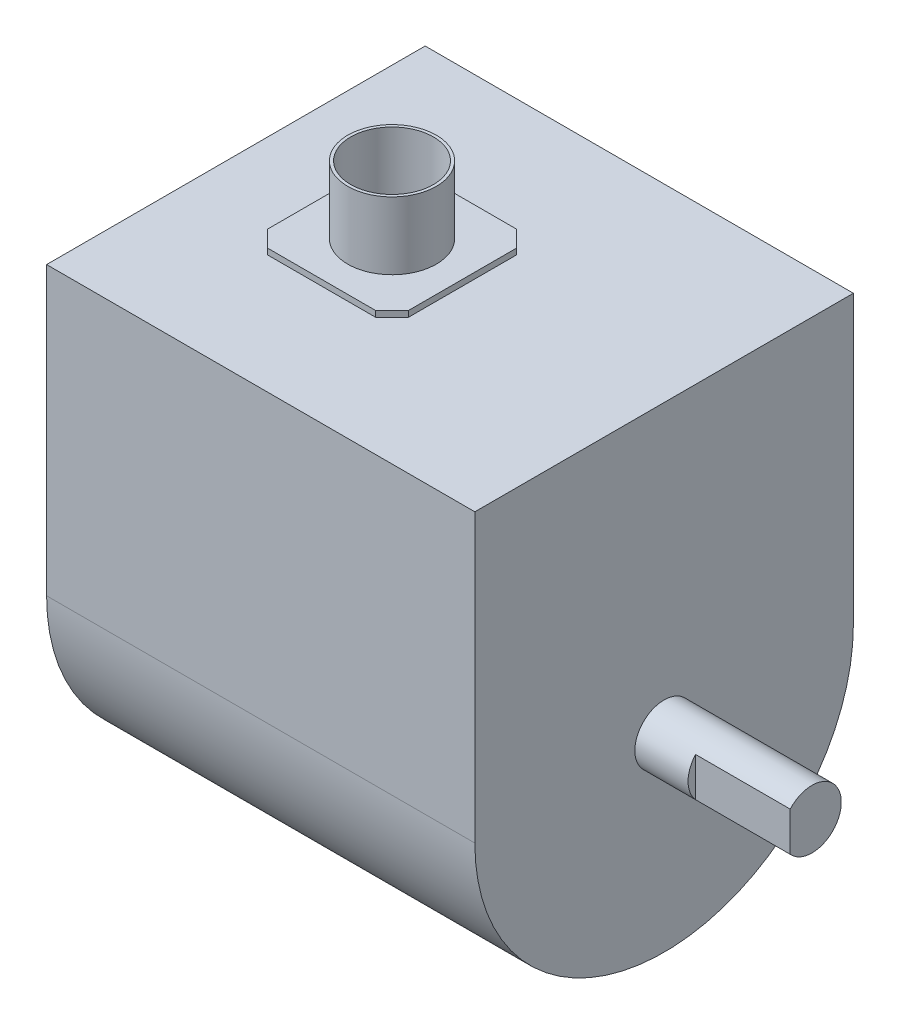
ISO-10303-21;
HEADER;
FILE_DESCRIPTION(('STEP AP214'),'2;1');
FILE_NAME('part.step','',(''),(''),'','','');
FILE_SCHEMA(('AUTOMOTIVE_DESIGN { 1 0 10303 214 1 1 1 1 }'));
ENDSEC;
DATA;
#1=APPLICATION_CONTEXT('core data for automotive mechanical design processes');
#2=APPLICATION_PROTOCOL_DEFINITION('international standard','automotive_design',2000,#1);
#3=PRODUCT_CONTEXT('',#1,'mechanical');
#4=PRODUCT('Part','Part','',(#3));
#5=PRODUCT_RELATED_PRODUCT_CATEGORY('part','',(#4));
#6=PRODUCT_DEFINITION_FORMATION('','',#4);
#7=PRODUCT_DEFINITION_CONTEXT('part definition',#1,'design');
#8=PRODUCT_DEFINITION('design','',#6,#7);
#9=PRODUCT_DEFINITION_SHAPE('','',#8);
#10=(LENGTH_UNIT() NAMED_UNIT(*) SI_UNIT(.MILLI.,.METRE.));
#11=(NAMED_UNIT(*) PLANE_ANGLE_UNIT() SI_UNIT($,.RADIAN.));
#12=(NAMED_UNIT(*) SI_UNIT($,.STERADIAN.) SOLID_ANGLE_UNIT());
#13=UNCERTAINTY_MEASURE_WITH_UNIT(LENGTH_MEASURE(1.E-05),#10,'distance_accuracy_value','');
#14=(GEOMETRIC_REPRESENTATION_CONTEXT(3) GLOBAL_UNCERTAINTY_ASSIGNED_CONTEXT((#13)) GLOBAL_UNIT_ASSIGNED_CONTEXT((#10,
#11,#12)) REPRESENTATION_CONTEXT('',''));
#15=CARTESIAN_POINT('',(0.,0.,0.));
#16=DIRECTION('',(0.,0.,1.));
#17=DIRECTION('',(1.,0.,0.));
#18=AXIS2_PLACEMENT_3D('',#15,#16,#17);
#19=CARTESIAN_POINT('',(-72.4,24.25,0.));
#20=DIRECTION('',(0.,1.,0.));
#21=DIRECTION('',(0.,0.,1.));
#22=AXIS2_PLACEMENT_3D('',#19,#20,#21);
#23=PLANE('',#22);
#24=DIRECTION('',(0.,0.,1.));
#25=VECTOR('',#24,1.);
#26=CARTESIAN_POINT('',(0.,24.25,0.));
#27=LINE('',#26,#25);
#28=CARTESIAN_POINT('',(0.,24.25,-32.));
#29=VERTEX_POINT('',#28);
#30=CARTESIAN_POINT('',(0.,24.25,32.));
#31=VERTEX_POINT('',#30);
#32=EDGE_CURVE('E263',#29,#31,#27,.T.);
#33=ORIENTED_EDGE('',*,*,#32,.F.);
#34=DIRECTION('',(1.,0.,0.));
#35=VECTOR('',#34,1.);
#36=CARTESIAN_POINT('',(-72.4,24.25,-32.));
#37=LINE('',#36,#35);
#38=CARTESIAN_POINT('',(-72.4,24.25,-32.));
#39=VERTEX_POINT('',#38);
#40=EDGE_CURVE('E272',#39,#29,#37,.T.);
#41=ORIENTED_EDGE('',*,*,#40,.F.);
#42=DIRECTION('',(0.,0.,1.));
#43=VECTOR('',#42,1.);
#44=CARTESIAN_POINT('',(-72.4,24.25,0.));
#45=LINE('',#44,#43);
#46=CARTESIAN_POINT('',(-72.4,24.25,32.));
#47=VERTEX_POINT('',#46);
#48=EDGE_CURVE('E252',#39,#47,#45,.T.);
#49=ORIENTED_EDGE('',*,*,#48,.T.);
#50=DIRECTION('',(1.,0.,0.));
#51=VECTOR('',#50,1.);
#52=CARTESIAN_POINT('',(-72.4,24.25,32.));
#53=LINE('',#52,#51);
#54=EDGE_CURVE('E270',#47,#31,#53,.T.);
#55=ORIENTED_EDGE('',*,*,#54,.T.);
#56=EDGE_LOOP('',(#33,#41,#49,#55));
#57=FACE_BOUND('',#56,.T.);
#58=DIRECTION('',(0.,0.,1.));
#59=VECTOR('',#58,1.);
#60=CARTESIAN_POINT('',(-57.9126,24.25,-9.1313));
#61=LINE('',#60,#59);
#62=CARTESIAN_POINT('',(-57.9126,24.25,-9.1313));
#63=VERTEX_POINT('',#62);
#64=CARTESIAN_POINT('',(-57.9126,24.25,9.1313));
#65=VERTEX_POINT('',#64);
#66=EDGE_CURVE('E211',#63,#65,#61,.T.);
#67=ORIENTED_EDGE('',*,*,#66,.F.);
#68=DIRECTION('',(-0.707106781186527,0.,0.707106781186568));
#69=VECTOR('',#68,1.);
#70=CARTESIAN_POINT('',(-55.1313,24.25,-11.9126000000001));
#71=LINE('',#70,#69);
#72=CARTESIAN_POINT('',(-55.1313,24.25,-11.9126000000001));
#73=VERTEX_POINT('',#72);
#74=EDGE_CURVE('E208',#73,#63,#71,.T.);
#75=ORIENTED_EDGE('',*,*,#74,.F.);
#76=DIRECTION('',(-1.,0.,0.));
#77=VECTOR('',#76,1.);
#78=CARTESIAN_POINT('',(-36.8687,24.25,-11.9126000000001));
#79=LINE('',#78,#77);
#80=CARTESIAN_POINT('',(-36.8687,24.25,-11.9126000000001));
#81=VERTEX_POINT('',#80);
#82=EDGE_CURVE('E193',#81,#73,#79,.T.);
#83=ORIENTED_EDGE('',*,*,#82,.F.);
#84=DIRECTION('',(-0.70710678118653,0.,-0.707106781186565));
#85=VECTOR('',#84,1.);
#86=CARTESIAN_POINT('',(-34.0874,24.25,-9.1313));
#87=LINE('',#86,#85);
#88=CARTESIAN_POINT('',(-34.0874,24.25,-9.1313));
#89=VERTEX_POINT('',#88);
#90=EDGE_CURVE('E221',#89,#81,#87,.T.);
#91=ORIENTED_EDGE('',*,*,#90,.F.);
#92=DIRECTION('',(0.,0.,-1.));
#93=VECTOR('',#92,1.);
#94=CARTESIAN_POINT('',(-34.0874,24.25,9.1313));
#95=LINE('',#94,#93);
#96=CARTESIAN_POINT('',(-34.0874,24.25,9.1313));
#97=VERTEX_POINT('',#96);
#98=EDGE_CURVE('E219',#97,#89,#95,.T.);
#99=ORIENTED_EDGE('',*,*,#98,.F.);
#100=DIRECTION('',(0.707106781186529,0.,-0.707106781186566));
#101=VECTOR('',#100,1.);
#102=CARTESIAN_POINT('',(-36.8687,24.25,11.9126000000002));
#103=LINE('',#102,#101);
#104=CARTESIAN_POINT('',(-36.8687,24.25,11.9126000000002));
#105=VERTEX_POINT('',#104);
#106=EDGE_CURVE('E217',#105,#97,#103,.T.);
#107=ORIENTED_EDGE('',*,*,#106,.F.);
#108=DIRECTION('',(1.,0.,0.));
#109=VECTOR('',#108,1.);
#110=CARTESIAN_POINT('',(-55.1313,24.25,11.9126000000002));
#111=LINE('',#110,#109);
#112=CARTESIAN_POINT('',(-55.1313,24.25,11.9126000000002));
#113=VERTEX_POINT('',#112);
#114=EDGE_CURVE('E215',#113,#105,#111,.T.);
#115=ORIENTED_EDGE('',*,*,#114,.F.);
#116=DIRECTION('',(0.707106781186528,0.,0.707106781186567));
#117=VECTOR('',#116,1.);
#118=CARTESIAN_POINT('',(-57.9126,24.25,9.1313));
#119=LINE('',#118,#117);
#120=EDGE_CURVE('E213',#65,#113,#119,.T.);
#121=ORIENTED_EDGE('',*,*,#120,.F.);
#122=EDGE_LOOP('',(#67,#75,#83,#91,#99,#107,#115,#121));
#123=FACE_BOUND('',#122,.T.);
#124=ADVANCED_FACE('F37',(#57,#123),#23,.T.);
#125=CARTESIAN_POINT('',(-72.4,-24.25,0.));
#126=DIRECTION('',(1.,0.,0.));
#127=DIRECTION('',(0.,0.,-1.));
#128=AXIS2_PLACEMENT_3D('',#125,#126,#127);
#129=CYLINDRICAL_SURFACE('',#128,32.);
#130=CARTESIAN_POINT('',(0.,-24.25,0.));
#131=DIRECTION('',(1.,0.,0.));
#132=DIRECTION('',(0.,0.,-1.));
#133=AXIS2_PLACEMENT_3D('',#130,#131,#132);
#134=CIRCLE('',#133,32.);
#135=CARTESIAN_POINT('',(0.,-24.25,-32.));
#136=VERTEX_POINT('',#135);
#137=CARTESIAN_POINT('',(0.,-24.25,32.));
#138=VERTEX_POINT('',#137);
#139=EDGE_CURVE('E246',#136,#138,#134,.F.);
#140=ORIENTED_EDGE('',*,*,#139,.T.);
#141=DIRECTION('',(1.,0.,0.));
#142=VECTOR('',#141,1.);
#143=CARTESIAN_POINT('',(-72.4,-24.25,32.));
#144=LINE('',#143,#142);
#145=CARTESIAN_POINT('',(-72.4,-24.25,32.));
#146=VERTEX_POINT('',#145);
#147=EDGE_CURVE('E268',#146,#138,#144,.T.);
#148=ORIENTED_EDGE('',*,*,#147,.F.);
#149=CARTESIAN_POINT('',(-72.4,-24.25,0.));
#150=DIRECTION('',(1.,0.,0.));
#151=DIRECTION('',(0.,0.,-1.));
#152=AXIS2_PLACEMENT_3D('',#149,#150,#151);
#153=CIRCLE('',#152,32.);
#154=CARTESIAN_POINT('',(-72.4,-24.25,-32.));
#155=VERTEX_POINT('',#154);
#156=EDGE_CURVE('E247',#155,#146,#153,.F.);
#157=ORIENTED_EDGE('',*,*,#156,.F.);
#158=DIRECTION('',(1.,0.,0.));
#159=VECTOR('',#158,1.);
#160=CARTESIAN_POINT('',(-72.4,-24.25,-32.));
#161=LINE('',#160,#159);
#162=EDGE_CURVE('E258',#155,#136,#161,.T.);
#163=ORIENTED_EDGE('',*,*,#162,.T.);
#164=EDGE_LOOP('',(#140,#148,#157,#163));
#165=FACE_BOUND('',#164,.T.);
#166=ADVANCED_FACE('F39',(#165),#129,.T.);
#167=CARTESIAN_POINT('',(-72.4,0.,32.));
#168=DIRECTION('',(0.,0.,1.));
#169=DIRECTION('',(0.,-1.,0.));
#170=AXIS2_PLACEMENT_3D('',#167,#168,#169);
#171=PLANE('',#170);
#172=DIRECTION('',(0.,-1.,0.));
#173=VECTOR('',#172,1.);
#174=CARTESIAN_POINT('',(0.,0.,32.));
#175=LINE('',#174,#173);
#176=EDGE_CURVE('E250',#31,#138,#175,.T.);
#177=ORIENTED_EDGE('',*,*,#176,.F.);
#178=ORIENTED_EDGE('',*,*,#54,.F.);
#179=DIRECTION('',(0.,-1.,0.));
#180=VECTOR('',#179,1.);
#181=CARTESIAN_POINT('',(-72.4,0.,32.));
#182=LINE('',#181,#180);
#183=EDGE_CURVE('E255',#47,#146,#182,.T.);
#184=ORIENTED_EDGE('',*,*,#183,.T.);
#185=ORIENTED_EDGE('',*,*,#147,.T.);
#186=EDGE_LOOP('',(#177,#178,#184,#185));
#187=FACE_BOUND('',#186,.T.);
#188=ADVANCED_FACE('F304',(#187),#171,.T.);
#189=CARTESIAN_POINT('',(-72.4,0.,-32.));
#190=DIRECTION('',(0.,0.,1.));
#191=DIRECTION('',(0.,-1.,0.));
#192=AXIS2_PLACEMENT_3D('',#189,#190,#191);
#193=PLANE('',#192);
#194=DIRECTION('',(0.,-1.,0.));
#195=VECTOR('',#194,1.);
#196=CARTESIAN_POINT('',(0.,0.,-32.));
#197=LINE('',#196,#195);
#198=EDGE_CURVE('E261',#29,#136,#197,.T.);
#199=ORIENTED_EDGE('',*,*,#198,.T.);
#200=ORIENTED_EDGE('',*,*,#162,.F.);
#201=DIRECTION('',(0.,-1.,0.));
#202=VECTOR('',#201,1.);
#203=CARTESIAN_POINT('',(-72.4,0.,-32.));
#204=LINE('',#203,#202);
#205=EDGE_CURVE('E249',#39,#155,#204,.T.);
#206=ORIENTED_EDGE('',*,*,#205,.F.);
#207=ORIENTED_EDGE('',*,*,#40,.T.);
#208=EDGE_LOOP('',(#199,#200,#206,#207));
#209=FACE_BOUND('',#208,.T.);
#210=ADVANCED_FACE('F310',(#209),#193,.F.);
#211=CARTESIAN_POINT('',(-72.4,0.,0.));
#212=DIRECTION('',(1.,0.,0.));
#213=DIRECTION('',(0.,0.,-1.));
#214=AXIS2_PLACEMENT_3D('',#211,#212,#213);
#215=PLANE('',#214);
#216=CARTESIAN_POINT('',(-72.4,-24.25,0.));
#217=DIRECTION('',(1.,0.,0.));
#218=DIRECTION('',(0.,0.,-1.));
#219=AXIS2_PLACEMENT_3D('',#216,#217,#218);
#220=CIRCLE('',#219,4.953);
#221=CARTESIAN_POINT('',(-72.4,-24.25,-4.95299999999999));
#222=VERTEX_POINT('',#221);
#223=EDGE_CURVE('E158',#222,#222,#220,.F.);
#224=ORIENTED_EDGE('',*,*,#223,.F.);
#225=EDGE_LOOP('',(#224));
#226=FACE_BOUND('',#225,.T.);
#227=ORIENTED_EDGE('',*,*,#156,.T.);
#228=ORIENTED_EDGE('',*,*,#183,.F.);
#229=ORIENTED_EDGE('',*,*,#48,.F.);
#230=ORIENTED_EDGE('',*,*,#205,.T.);
#231=EDGE_LOOP('',(#227,#228,#229,#230));
#232=FACE_BOUND('',#231,.T.);
#233=ADVANCED_FACE('F312',(#226,#232),#215,.F.);
#234=CARTESIAN_POINT('',(0.,0.,0.));
#235=DIRECTION('',(1.,0.,0.));
#236=DIRECTION('',(0.,0.,-1.));
#237=AXIS2_PLACEMENT_3D('',#234,#235,#236);
#238=PLANE('',#237);
#239=CARTESIAN_POINT('',(0.,-24.25,0.));
#240=DIRECTION('',(1.,0.,0.));
#241=DIRECTION('',(0.,0.,-1.));
#242=AXIS2_PLACEMENT_3D('',#239,#240,#241);
#243=CIRCLE('',#242,4.953);
#244=CARTESIAN_POINT('',(0.,-24.25,-4.95299999999999));
#245=VERTEX_POINT('',#244);
#246=EDGE_CURVE('E168',#245,#245,#243,.T.);
#247=ORIENTED_EDGE('',*,*,#246,.F.);
#248=EDGE_LOOP('',(#247));
#249=FACE_BOUND('',#248,.T.);
#250=ORIENTED_EDGE('',*,*,#139,.F.);
#251=ORIENTED_EDGE('',*,*,#198,.F.);
#252=ORIENTED_EDGE('',*,*,#32,.T.);
#253=ORIENTED_EDGE('',*,*,#176,.T.);
#254=EDGE_LOOP('',(#250,#251,#252,#253));
#255=FACE_BOUND('',#254,.T.);
#256=ADVANCED_FACE('F318',(#249,#255),#238,.T.);
#257=CARTESIAN_POINT('',(-55.1313,25.25,-11.9126000000001));
#258=DIRECTION('',(0.707106781186568,0.,0.707106781186527));
#259=DIRECTION('',(0.707106781186527,0.,-0.707106781186568));
#260=AXIS2_PLACEMENT_3D('',#257,#258,#259);
#261=PLANE('',#260);
#262=ORIENTED_EDGE('',*,*,#74,.T.);
#263=DIRECTION('',(0.,-1.,0.));
#264=VECTOR('',#263,1.);
#265=CARTESIAN_POINT('',(-57.9126,25.25,-9.1313));
#266=LINE('',#265,#264);
#267=CARTESIAN_POINT('',(-57.9126,25.25,-9.1313));
#268=VERTEX_POINT('',#267);
#269=EDGE_CURVE('E244',#268,#63,#266,.T.);
#270=ORIENTED_EDGE('',*,*,#269,.F.);
#271=DIRECTION('',(-0.707106781186527,0.,0.707106781186568));
#272=VECTOR('',#271,1.);
#273=CARTESIAN_POINT('',(-55.1313,25.25,-11.9126000000001));
#274=LINE('',#273,#272);
#275=CARTESIAN_POINT('',(-55.1313,25.25,-11.9126000000001));
#276=VERTEX_POINT('',#275);
#277=EDGE_CURVE('E189',#276,#268,#274,.T.);
#278=ORIENTED_EDGE('',*,*,#277,.F.);
#279=DIRECTION('',(0.,-1.,0.));
#280=VECTOR('',#279,1.);
#281=CARTESIAN_POINT('',(-55.1313,25.25,-11.9126000000001));
#282=LINE('',#281,#280);
#283=EDGE_CURVE('E207',#276,#73,#282,.T.);
#284=ORIENTED_EDGE('',*,*,#283,.T.);
#285=EDGE_LOOP('',(#262,#270,#278,#284));
#286=FACE_BOUND('',#285,.T.);
#287=ADVANCED_FACE('F334',(#286),#261,.F.);
#288=CARTESIAN_POINT('',(-57.9126,25.25,-9.1313));
#289=DIRECTION('',(1.,0.,0.));
#290=DIRECTION('',(0.,0.,-1.));
#291=AXIS2_PLACEMENT_3D('',#288,#289,#290);
#292=PLANE('',#291);
#293=ORIENTED_EDGE('',*,*,#66,.T.);
#294=DIRECTION('',(0.,-1.,0.));
#295=VECTOR('',#294,1.);
#296=CARTESIAN_POINT('',(-57.9126,25.25,9.1313));
#297=LINE('',#296,#295);
#298=CARTESIAN_POINT('',(-57.9126,25.25,9.1313));
#299=VERTEX_POINT('',#298);
#300=EDGE_CURVE('E241',#299,#65,#297,.T.);
#301=ORIENTED_EDGE('',*,*,#300,.F.);
#302=DIRECTION('',(0.,0.,1.));
#303=VECTOR('',#302,1.);
#304=CARTESIAN_POINT('',(-57.9126,25.25,-9.1313));
#305=LINE('',#304,#303);
#306=EDGE_CURVE('E192',#268,#299,#305,.T.);
#307=ORIENTED_EDGE('',*,*,#306,.F.);
#308=ORIENTED_EDGE('',*,*,#269,.T.);
#309=EDGE_LOOP('',(#293,#301,#307,#308));
#310=FACE_BOUND('',#309,.T.);
#311=ADVANCED_FACE('F339',(#310),#292,.F.);
#312=CARTESIAN_POINT('',(-57.9126,25.25,9.1313));
#313=DIRECTION('',(0.707106781186567,0.,-0.707106781186528));
#314=DIRECTION('',(-0.707106781186528,0.,-0.707106781186567));
#315=AXIS2_PLACEMENT_3D('',#312,#313,#314);
#316=PLANE('',#315);
#317=ORIENTED_EDGE('',*,*,#120,.T.);
#318=DIRECTION('',(0.,-1.,0.));
#319=VECTOR('',#318,1.);
#320=CARTESIAN_POINT('',(-55.1313,25.25,11.9126000000002));
#321=LINE('',#320,#319);
#322=CARTESIAN_POINT('',(-55.1313,25.25,11.9126000000002));
#323=VERTEX_POINT('',#322);
#324=EDGE_CURVE('E238',#323,#113,#321,.T.);
#325=ORIENTED_EDGE('',*,*,#324,.F.);
#326=DIRECTION('',(0.707106781186528,0.,0.707106781186567));
#327=VECTOR('',#326,1.);
#328=CARTESIAN_POINT('',(-57.9126,25.25,9.1313));
#329=LINE('',#328,#327);
#330=EDGE_CURVE('E195',#299,#323,#329,.T.);
#331=ORIENTED_EDGE('',*,*,#330,.F.);
#332=ORIENTED_EDGE('',*,*,#300,.T.);
#333=EDGE_LOOP('',(#317,#325,#331,#332));
#334=FACE_BOUND('',#333,.T.);
#335=ADVANCED_FACE('F346',(#334),#316,.F.);
#336=CARTESIAN_POINT('',(-55.1313,25.25,11.9126000000002));
#337=DIRECTION('',(0.,0.,-1.));
#338=DIRECTION('',(0.,1.,0.));
#339=AXIS2_PLACEMENT_3D('',#336,#337,#338);
#340=PLANE('',#339);
#341=ORIENTED_EDGE('',*,*,#114,.T.);
#342=DIRECTION('',(0.,-1.,0.));
#343=VECTOR('',#342,1.);
#344=CARTESIAN_POINT('',(-36.8687,25.25,11.9126000000002));
#345=LINE('',#344,#343);
#346=CARTESIAN_POINT('',(-36.8687,25.25,11.9126000000002));
#347=VERTEX_POINT('',#346);
#348=EDGE_CURVE('E235',#347,#105,#345,.T.);
#349=ORIENTED_EDGE('',*,*,#348,.F.);
#350=DIRECTION('',(1.,0.,0.));
#351=VECTOR('',#350,1.);
#352=CARTESIAN_POINT('',(-55.1313,25.25,11.9126000000002));
#353=LINE('',#352,#351);
#354=EDGE_CURVE('E197',#323,#347,#353,.T.);
#355=ORIENTED_EDGE('',*,*,#354,.F.);
#356=ORIENTED_EDGE('',*,*,#324,.T.);
#357=EDGE_LOOP('',(#341,#349,#355,#356));
#358=FACE_BOUND('',#357,.T.);
#359=ADVANCED_FACE('F350',(#358),#340,.F.);
#360=CARTESIAN_POINT('',(-36.8687,25.25,11.9126000000002));
#361=DIRECTION('',(-0.707106781186566,0.,-0.707106781186529));
#362=DIRECTION('',(-0.707106781186529,0.,0.707106781186566));
#363=AXIS2_PLACEMENT_3D('',#360,#361,#362);
#364=PLANE('',#363);
#365=ORIENTED_EDGE('',*,*,#106,.T.);
#366=DIRECTION('',(0.,-1.,0.));
#367=VECTOR('',#366,1.);
#368=CARTESIAN_POINT('',(-34.0874,25.25,9.1313));
#369=LINE('',#368,#367);
#370=CARTESIAN_POINT('',(-34.0874,25.25,9.1313));
#371=VERTEX_POINT('',#370);
#372=EDGE_CURVE('E232',#371,#97,#369,.T.);
#373=ORIENTED_EDGE('',*,*,#372,.F.);
#374=DIRECTION('',(0.707106781186529,0.,-0.707106781186566));
#375=VECTOR('',#374,1.);
#376=CARTESIAN_POINT('',(-36.8687,25.25,11.9126000000002));
#377=LINE('',#376,#375);
#378=EDGE_CURVE('E199',#347,#371,#377,.T.);
#379=ORIENTED_EDGE('',*,*,#378,.F.);
#380=ORIENTED_EDGE('',*,*,#348,.T.);
#381=EDGE_LOOP('',(#365,#373,#379,#380));
#382=FACE_BOUND('',#381,.T.);
#383=ADVANCED_FACE('F354',(#382),#364,.F.);
#384=CARTESIAN_POINT('',(-34.0874,25.25,9.1313));
#385=DIRECTION('',(-1.,0.,0.));
#386=DIRECTION('',(0.,0.,1.));
#387=AXIS2_PLACEMENT_3D('',#384,#385,#386);
#388=PLANE('',#387);
#389=ORIENTED_EDGE('',*,*,#98,.T.);
#390=DIRECTION('',(0.,-1.,0.));
#391=VECTOR('',#390,1.);
#392=CARTESIAN_POINT('',(-34.0874,25.25,-9.1313));
#393=LINE('',#392,#391);
#394=CARTESIAN_POINT('',(-34.0874,25.25,-9.1313));
#395=VERTEX_POINT('',#394);
#396=EDGE_CURVE('E229',#395,#89,#393,.T.);
#397=ORIENTED_EDGE('',*,*,#396,.F.);
#398=DIRECTION('',(0.,0.,-1.));
#399=VECTOR('',#398,1.);
#400=CARTESIAN_POINT('',(-34.0874,25.25,9.1313));
#401=LINE('',#400,#399);
#402=EDGE_CURVE('E201',#371,#395,#401,.T.);
#403=ORIENTED_EDGE('',*,*,#402,.F.);
#404=ORIENTED_EDGE('',*,*,#372,.T.);
#405=EDGE_LOOP('',(#389,#397,#403,#404));
#406=FACE_BOUND('',#405,.T.);
#407=ADVANCED_FACE('F358',(#406),#388,.F.);
#408=CARTESIAN_POINT('',(-34.0874,25.25,-9.1313));
#409=DIRECTION('',(-0.707106781186566,0.,0.70710678118653));
#410=DIRECTION('',(0.70710678118653,0.,0.707106781186565));
#411=AXIS2_PLACEMENT_3D('',#408,#409,#410);
#412=PLANE('',#411);
#413=ORIENTED_EDGE('',*,*,#90,.T.);
#414=DIRECTION('',(0.,-1.,0.));
#415=VECTOR('',#414,1.);
#416=CARTESIAN_POINT('',(-36.8687,25.25,-11.9126000000001));
#417=LINE('',#416,#415);
#418=CARTESIAN_POINT('',(-36.8687,25.25,-11.9126000000001));
#419=VERTEX_POINT('',#418);
#420=EDGE_CURVE('E227',#419,#81,#417,.T.);
#421=ORIENTED_EDGE('',*,*,#420,.F.);
#422=DIRECTION('',(-0.70710678118653,0.,-0.707106781186565));
#423=VECTOR('',#422,1.);
#424=CARTESIAN_POINT('',(-34.0874,25.25,-9.1313));
#425=LINE('',#424,#423);
#426=EDGE_CURVE('E203',#395,#419,#425,.T.);
#427=ORIENTED_EDGE('',*,*,#426,.F.);
#428=ORIENTED_EDGE('',*,*,#396,.T.);
#429=EDGE_LOOP('',(#413,#421,#427,#428));
#430=FACE_BOUND('',#429,.T.);
#431=ADVANCED_FACE('F362',(#430),#412,.F.);
#432=CARTESIAN_POINT('',(-36.8687,25.25,-11.9126000000001));
#433=DIRECTION('',(0.,0.,1.));
#434=DIRECTION('',(1.,0.,0.));
#435=AXIS2_PLACEMENT_3D('',#432,#433,#434);
#436=PLANE('',#435);
#437=ORIENTED_EDGE('',*,*,#82,.T.);
#438=ORIENTED_EDGE('',*,*,#283,.F.);
#439=DIRECTION('',(-1.,0.,0.));
#440=VECTOR('',#439,1.);
#441=CARTESIAN_POINT('',(-36.8687,25.25,-11.9126000000001));
#442=LINE('',#441,#440);
#443=EDGE_CURVE('E205',#419,#276,#442,.T.);
#444=ORIENTED_EDGE('',*,*,#443,.F.);
#445=ORIENTED_EDGE('',*,*,#420,.T.);
#446=EDGE_LOOP('',(#437,#438,#444,#445));
#447=FACE_BOUND('',#446,.T.);
#448=ADVANCED_FACE('F366',(#447),#436,.F.);
#449=CARTESIAN_POINT('',(0.,25.25,0.));
#450=DIRECTION('',(0.,1.,0.));
#451=DIRECTION('',(0.,0.,1.));
#452=AXIS2_PLACEMENT_3D('',#449,#450,#451);
#453=PLANE('',#452);
#454=CARTESIAN_POINT('',(-46.,25.25,0.));
#455=DIRECTION('',(0.,1.,0.));
#456=DIRECTION('',(0.,0.,1.));
#457=AXIS2_PLACEMENT_3D('',#454,#455,#456);
#458=CIRCLE('',#457,7.493);
#459=CARTESIAN_POINT('',(-46.,25.25,-7.493));
#460=VERTEX_POINT('',#459);
#461=EDGE_CURVE('E188',#460,#460,#458,.F.);
#462=ORIENTED_EDGE('',*,*,#461,.T.);
#463=EDGE_LOOP('',(#462));
#464=FACE_BOUND('',#463,.T.);
#465=ORIENTED_EDGE('',*,*,#277,.T.);
#466=ORIENTED_EDGE('',*,*,#306,.T.);
#467=ORIENTED_EDGE('',*,*,#330,.T.);
#468=ORIENTED_EDGE('',*,*,#354,.T.);
#469=ORIENTED_EDGE('',*,*,#378,.T.);
#470=ORIENTED_EDGE('',*,*,#402,.T.);
#471=ORIENTED_EDGE('',*,*,#426,.T.);
#472=ORIENTED_EDGE('',*,*,#443,.T.);
#473=EDGE_LOOP('',(#465,#466,#467,#468,#469,#470,#471,#472));
#474=FACE_BOUND('',#473,.T.);
#475=ADVANCED_FACE('F370',(#464,#474),#453,.T.);
#476=CARTESIAN_POINT('',(-46.,36.65,0.));
#477=DIRECTION('',(0.,-1.,0.));
#478=DIRECTION('',(0.,0.,-1.));
#479=AXIS2_PLACEMENT_3D('',#476,#477,#478);
#480=CYLINDRICAL_SURFACE('',#479,7.493);
#481=CARTESIAN_POINT('',(-46.,36.65,0.));
#482=DIRECTION('',(0.,1.,0.));
#483=DIRECTION('',(0.,0.,1.));
#484=AXIS2_PLACEMENT_3D('',#481,#482,#483);
#485=CIRCLE('',#484,7.493);
#486=CARTESIAN_POINT('',(-46.,36.65,-7.49299999999999));
#487=VERTEX_POINT('',#486);
#488=EDGE_CURVE('E183',#487,#487,#485,.T.);
#489=CARTESIAN_POINT('',(-46.,25.25,-7.493));
#490=CARTESIAN_POINT('',(-46.,25.36875,-7.493));
#491=CARTESIAN_POINT('',(-46.,25.4875,-7.493));
#492=CARTESIAN_POINT('',(-46.,25.725,-7.493));
#493=CARTESIAN_POINT('',(-46.,25.84375,-7.493));
#494=CARTESIAN_POINT('',(-46.,26.08125,-7.493));
#495=CARTESIAN_POINT('',(-46.,26.2,-7.493));
#496=CARTESIAN_POINT('',(-46.,26.4375,-7.493));
#497=CARTESIAN_POINT('',(-46.,26.55625,-7.493));
#498=CARTESIAN_POINT('',(-46.,26.79375,-7.493));
#499=CARTESIAN_POINT('',(-46.,26.9125,-7.493));
#500=CARTESIAN_POINT('',(-46.,27.15,-7.493));
#501=CARTESIAN_POINT('',(-46.,27.26875,-7.493));
#502=CARTESIAN_POINT('',(-46.,27.50625,-7.493));
#503=CARTESIAN_POINT('',(-46.,27.625,-7.493));
#504=CARTESIAN_POINT('',(-46.,27.8625,-7.493));
#505=CARTESIAN_POINT('',(-46.,27.98125,-7.493));
#506=CARTESIAN_POINT('',(-46.,28.21875,-7.493));
#507=CARTESIAN_POINT('',(-46.,28.3375,-7.493));
#508=CARTESIAN_POINT('',(-46.,28.575,-7.493));
#509=CARTESIAN_POINT('',(-46.,28.69375,-7.493));
#510=CARTESIAN_POINT('',(-46.,28.93125,-7.493));
#511=CARTESIAN_POINT('',(-46.,29.05,-7.493));
#512=CARTESIAN_POINT('',(-46.,29.2875,-7.493));
#513=CARTESIAN_POINT('',(-46.,29.40625,-7.493));
#514=CARTESIAN_POINT('',(-46.,29.64375,-7.493));
#515=CARTESIAN_POINT('',(-46.,29.7625,-7.493));
#516=CARTESIAN_POINT('',(-46.,30.,-7.493));
#517=CARTESIAN_POINT('',(-46.,30.11875,-7.493));
#518=CARTESIAN_POINT('',(-46.,30.35625,-7.493));
#519=CARTESIAN_POINT('',(-46.,30.475,-7.493));
#520=CARTESIAN_POINT('',(-46.,30.7125,-7.493));
#521=CARTESIAN_POINT('',(-46.,30.83125,-7.493));
#522=CARTESIAN_POINT('',(-46.,31.06875,-7.493));
#523=CARTESIAN_POINT('',(-46.,31.1875,-7.493));
#524=CARTESIAN_POINT('',(-46.,31.425,-7.493));
#525=CARTESIAN_POINT('',(-46.,31.54375,-7.493));
#526=CARTESIAN_POINT('',(-46.,31.78125,-7.493));
#527=CARTESIAN_POINT('',(-46.,31.9,-7.493));
#528=CARTESIAN_POINT('',(-46.,32.1375,-7.493));
#529=CARTESIAN_POINT('',(-46.,32.25625,-7.493));
#530=CARTESIAN_POINT('',(-46.,32.49375,-7.493));
#531=CARTESIAN_POINT('',(-46.,32.6125,-7.49299999999999));
#532=CARTESIAN_POINT('',(-46.,32.85,-7.49299999999999));
#533=CARTESIAN_POINT('',(-46.,32.96875,-7.49299999999999));
#534=CARTESIAN_POINT('',(-46.,33.20625,-7.49299999999999));
#535=CARTESIAN_POINT('',(-46.,33.325,-7.49299999999999));
#536=CARTESIAN_POINT('',(-46.,33.5625,-7.49299999999999));
#537=CARTESIAN_POINT('',(-46.,33.68125,-7.49299999999999));
#538=CARTESIAN_POINT('',(-46.,33.91875,-7.49299999999999));
#539=CARTESIAN_POINT('',(-46.,34.0375,-7.49299999999999));
#540=CARTESIAN_POINT('',(-46.,34.275,-7.49299999999999));
#541=CARTESIAN_POINT('',(-46.,34.39375,-7.49299999999999));
#542=CARTESIAN_POINT('',(-46.,34.63125,-7.49299999999999));
#543=CARTESIAN_POINT('',(-46.,34.75,-7.49299999999999));
#544=CARTESIAN_POINT('',(-46.,34.9875,-7.49299999999999));
#545=CARTESIAN_POINT('',(-46.,35.10625,-7.49299999999999));
#546=CARTESIAN_POINT('',(-46.,35.34375,-7.49299999999999));
#547=CARTESIAN_POINT('',(-46.,35.4625,-7.49299999999999));
#548=CARTESIAN_POINT('',(-46.,35.7,-7.49299999999999));
#549=CARTESIAN_POINT('',(-46.,35.81875,-7.49299999999999));
#550=CARTESIAN_POINT('',(-46.,36.05625,-7.49299999999999));
#551=CARTESIAN_POINT('',(-46.,36.175,-7.49299999999999));
#552=CARTESIAN_POINT('',(-46.,36.4125,-7.49299999999999));
#553=CARTESIAN_POINT('',(-46.,36.53125,-7.49299999999999));
#554=CARTESIAN_POINT('',(-46.,36.65,-7.49299999999999));
#555=B_SPLINE_CURVE_WITH_KNOTS('',3,(#489,#490,#491,#492,#493,#494,#495,#496,#497,#498,#499,
#500,#501,#502,#503,#504,#505,#506,#507,#508,#509,#510,#511,#512,#513,#514,#515,#516,#517,#518,
#519,#520,#521,#522,#523,#524,#525,#526,#527,#528,#529,#530,#531,#532,#533,#534,#535,#536,#537,
#538,#539,#540,#541,#542,#543,#544,#545,#546,#547,#548,#549,#550,#551,#552,#553,#554),
.UNSPECIFIED.,.F.,.F.,(4,2,2,2,2,2,2,2,2,2,2,2,2,2,2,2,2,2,2,2,2,2,2,2,2,2,2,2,2,2,2,2,4),(0.,
0.356250000000002,0.712500000000001,1.06875,1.425,1.78125000000001,2.1375,2.49375,
2.85000000000001,3.20625,3.5625,3.91875,4.275,4.63125,4.9875,5.34375,5.7,6.05625,6.4125,6.76875,
7.12500000000001,7.48125,7.8375,8.19375000000001,8.55,8.90625,9.26250000000001,9.61875,9.975,
10.33125,10.6875,11.04375,11.4),.UNSPECIFIED.);
#556=EDGE_CURVE('BSEAM374',#460,#487,#555,.T.);
#557=ORIENTED_EDGE('',*,*,#461,.F.);
#558=ORIENTED_EDGE('',*,*,#488,.F.);
#559=ORIENTED_EDGE('',*,*,#556,.T.);
#560=ORIENTED_EDGE('',*,*,#556,.F.);
#561=EDGE_LOOP('',(#557,#559,#558,#560));
#562=FACE_BOUND('',#561,.T.);
#563=ADVANCED_FACE('F374',(#562),#480,.T.);
#564=CARTESIAN_POINT('',(-46.,36.65,0.));
#565=DIRECTION('',(0.,1.,0.));
#566=DIRECTION('',(0.,0.,1.));
#567=AXIS2_PLACEMENT_3D('',#564,#565,#566);
#568=PLANE('',#567);
#569=CARTESIAN_POINT('',(-46.,36.65,0.));
#570=DIRECTION('',(0.,1.,0.));
#571=DIRECTION('',(0.,0.,1.));
#572=AXIS2_PLACEMENT_3D('',#569,#570,#571);
#573=CIRCLE('',#572,6.993);
#574=CARTESIAN_POINT('',(-46.,36.65,6.99300000000001));
#575=VERTEX_POINT('',#574);
#576=EDGE_CURVE('E178',#575,#575,#573,.T.);
#577=ORIENTED_EDGE('',*,*,#576,.F.);
#578=EDGE_LOOP('',(#577));
#579=FACE_BOUND('',#578,.T.);
#580=ORIENTED_EDGE('',*,*,#488,.T.);
#581=EDGE_LOOP('',(#580));
#582=FACE_BOUND('',#581,.T.);
#583=ADVANCED_FACE('F378',(#579,#582),#568,.T.);
#584=CARTESIAN_POINT('',(-46.,24.25,0.));
#585=DIRECTION('',(0.,1.,0.));
#586=DIRECTION('',(0.,0.,1.));
#587=AXIS2_PLACEMENT_3D('',#584,#585,#586);
#588=CYLINDRICAL_SURFACE('',#587,6.993);
#589=CARTESIAN_POINT('',(-46.,24.25,0.));
#590=DIRECTION('',(0.,1.,0.));
#591=DIRECTION('',(0.,0.,1.));
#592=AXIS2_PLACEMENT_3D('',#589,#590,#591);
#593=CIRCLE('',#592,6.993);
#594=CARTESIAN_POINT('',(-46.,24.25,6.993));
#595=VERTEX_POINT('',#594);
#596=EDGE_CURVE('E180',#595,#595,#593,.T.);
#597=CARTESIAN_POINT('',(-46.,24.25,6.993));
#598=CARTESIAN_POINT('',(-46.,24.3791666666667,6.993));
#599=CARTESIAN_POINT('',(-46.,24.5083333333333,6.993));
#600=CARTESIAN_POINT('',(-46.,24.7666666666667,6.993));
#601=CARTESIAN_POINT('',(-46.,24.8958333333333,6.993));
#602=CARTESIAN_POINT('',(-46.,25.1541666666667,6.993));
#603=CARTESIAN_POINT('',(-46.,25.2833333333333,6.993));
#604=CARTESIAN_POINT('',(-46.,25.5416666666667,6.993));
#605=CARTESIAN_POINT('',(-46.,25.6708333333333,6.993));
#606=CARTESIAN_POINT('',(-46.,25.9291666666667,6.993));
#607=CARTESIAN_POINT('',(-46.,26.0583333333333,6.993));
#608=CARTESIAN_POINT('',(-46.,26.3166666666667,6.993));
#609=CARTESIAN_POINT('',(-46.,26.4458333333333,6.993));
#610=CARTESIAN_POINT('',(-46.,26.7041666666667,6.993));
#611=CARTESIAN_POINT('',(-46.,26.8333333333333,6.993));
#612=CARTESIAN_POINT('',(-46.,27.0916666666667,6.993));
#613=CARTESIAN_POINT('',(-46.,27.2208333333333,6.993));
#614=CARTESIAN_POINT('',(-46.,27.4791666666667,6.993));
#615=CARTESIAN_POINT('',(-46.,27.6083333333333,6.993));
#616=CARTESIAN_POINT('',(-46.,27.8666666666667,6.993));
#617=CARTESIAN_POINT('',(-46.,27.9958333333333,6.993));
#618=CARTESIAN_POINT('',(-46.,28.2541666666667,6.993));
#619=CARTESIAN_POINT('',(-46.,28.3833333333333,6.993));
#620=CARTESIAN_POINT('',(-46.,28.6416666666667,6.993));
#621=CARTESIAN_POINT('',(-46.,28.7708333333333,6.993));
#622=CARTESIAN_POINT('',(-46.,29.0291666666667,6.993));
#623=CARTESIAN_POINT('',(-46.,29.1583333333333,6.993));
#624=CARTESIAN_POINT('',(-46.,29.4166666666667,6.993));
#625=CARTESIAN_POINT('',(-46.,29.5458333333333,6.993));
#626=CARTESIAN_POINT('',(-46.,29.8041666666667,6.993));
#627=CARTESIAN_POINT('',(-46.,29.9333333333333,6.993));
#628=CARTESIAN_POINT('',(-46.,30.1916666666667,6.993));
#629=CARTESIAN_POINT('',(-46.,30.3208333333333,6.993));
#630=CARTESIAN_POINT('',(-46.,30.5791666666667,6.993));
#631=CARTESIAN_POINT('',(-46.,30.7083333333333,6.993));
#632=CARTESIAN_POINT('',(-46.,30.9666666666667,6.993));
#633=CARTESIAN_POINT('',(-46.,31.0958333333333,6.993));
#634=CARTESIAN_POINT('',(-46.,31.3541666666667,6.993));
#635=CARTESIAN_POINT('',(-46.,31.4833333333333,6.993));
#636=CARTESIAN_POINT('',(-46.,31.7416666666667,6.993));
#637=CARTESIAN_POINT('',(-46.,31.8708333333333,6.993));
#638=CARTESIAN_POINT('',(-46.,32.1291666666667,6.993));
#639=CARTESIAN_POINT('',(-46.,32.2583333333333,6.993));
#640=CARTESIAN_POINT('',(-46.,32.5166666666667,6.993));
#641=CARTESIAN_POINT('',(-46.,32.6458333333333,6.993));
#642=CARTESIAN_POINT('',(-46.,32.9041666666667,6.993));
#643=CARTESIAN_POINT('',(-46.,33.0333333333333,6.993));
#644=CARTESIAN_POINT('',(-46.,33.2916666666667,6.993));
#645=CARTESIAN_POINT('',(-46.,33.4208333333333,6.993));
#646=CARTESIAN_POINT('',(-46.,33.6791666666667,6.993));
#647=CARTESIAN_POINT('',(-46.,33.8083333333333,6.993));
#648=CARTESIAN_POINT('',(-46.,34.0666666666667,6.993));
#649=CARTESIAN_POINT('',(-46.,34.1958333333333,6.993));
#650=CARTESIAN_POINT('',(-46.,34.4541666666667,6.993));
#651=CARTESIAN_POINT('',(-46.,34.5833333333333,6.993));
#652=CARTESIAN_POINT('',(-46.,34.8416666666667,6.993));
#653=CARTESIAN_POINT('',(-46.,34.9708333333333,6.993));
#654=CARTESIAN_POINT('',(-46.,35.2291666666667,6.993));
#655=CARTESIAN_POINT('',(-46.,35.3583333333333,6.993));
#656=CARTESIAN_POINT('',(-46.,35.6166666666667,6.993));
#657=CARTESIAN_POINT('',(-46.,35.7458333333333,6.993));
#658=CARTESIAN_POINT('',(-46.,36.0041666666667,6.993));
#659=CARTESIAN_POINT('',(-46.,36.1333333333333,6.99300000000001));
#660=CARTESIAN_POINT('',(-46.,36.3916666666667,6.99300000000001));
#661=CARTESIAN_POINT('',(-46.,36.5208333333333,6.99300000000001));
#662=CARTESIAN_POINT('',(-46.,36.65,6.99300000000001));
#663=B_SPLINE_CURVE_WITH_KNOTS('',3,(#597,#598,#599,#600,#601,#602,#603,#604,#605,#606,#607,
#608,#609,#610,#611,#612,#613,#614,#615,#616,#617,#618,#619,#620,#621,#622,#623,#624,#625,#626,
#627,#628,#629,#630,#631,#632,#633,#634,#635,#636,#637,#638,#639,#640,#641,#642,#643,#644,#645,
#646,#647,#648,#649,#650,#651,#652,#653,#654,#655,#656,#657,#658,#659,#660,#661,#662),
.UNSPECIFIED.,.F.,.F.,(4,2,2,2,2,2,2,2,2,2,2,2,2,2,2,2,2,2,2,2,2,2,2,2,2,2,2,2,2,2,2,2,4),(0.,
0.387500000000002,0.775000000000001,1.1625,1.55,1.9375,2.325,2.7125,3.1,3.4875,3.875,4.2625,
4.65,5.0375,5.425,5.8125,6.2,6.5875,6.975,7.3625,7.75,8.1375,8.525,8.9125,9.30000000000001,
9.68750000000001,10.075,10.4625,10.85,11.2375,11.625,12.0125,12.4),.UNSPECIFIED.);
#664=EDGE_CURVE('BSEAM382',#595,#575,#663,.T.);
#665=ORIENTED_EDGE('',*,*,#596,.F.);
#666=ORIENTED_EDGE('',*,*,#576,.T.);
#667=ORIENTED_EDGE('',*,*,#664,.T.);
#668=ORIENTED_EDGE('',*,*,#664,.F.);
#669=EDGE_LOOP('',(#665,#667,#666,#668));
#670=FACE_BOUND('',#669,.T.);
#671=ADVANCED_FACE('F382',(#670),#588,.F.);
#672=CARTESIAN_POINT('',(-46.,24.25,0.));
#673=DIRECTION('',(0.,1.,0.));
#674=DIRECTION('',(0.,0.,1.));
#675=AXIS2_PLACEMENT_3D('',#672,#673,#674);
#676=PLANE('',#675);
#677=ORIENTED_EDGE('',*,*,#596,.T.);
#678=EDGE_LOOP('',(#677));
#679=FACE_BOUND('',#678,.T.);
#680=ADVANCED_FACE('F296',(#679),#676,.T.);
#681=CARTESIAN_POINT('',(25.,-24.25,0.));
#682=DIRECTION('',(-1.,0.,0.));
#683=DIRECTION('',(0.,0.,1.));
#684=AXIS2_PLACEMENT_3D('',#681,#682,#683);
#685=CYLINDRICAL_SURFACE('',#684,4.953);
#686=DIRECTION('',(-1.,0.,0.));
#687=VECTOR('',#686,1.);
#688=CARTESIAN_POINT('',(25.,-27.5617548218429,3.68300000000001));
#689=LINE('',#688,#687);
#690=CARTESIAN_POINT('',(25.,-27.5617548218429,3.68300000000001));
#691=VERTEX_POINT('',#690);
#692=CARTESIAN_POINT('',(9.,-27.5617548218429,3.68300000000001));
#693=VERTEX_POINT('',#692);
#694=EDGE_CURVE('E52',#691,#693,#689,.T.);
#695=ORIENTED_EDGE('',*,*,#694,.T.);
#696=CARTESIAN_POINT('',(9.,-24.25,0.));
#697=DIRECTION('',(-1.,0.,0.));
#698=DIRECTION('',(0.,0.,1.));
#699=AXIS2_PLACEMENT_3D('',#696,#697,#698);
#700=CIRCLE('',#699,4.953);
#701=CARTESIAN_POINT('',(9.,-20.9382451781571,3.68300000000001));
#702=VERTEX_POINT('',#701);
#703=EDGE_CURVE('E11',#693,#702,#700,.T.);
#704=ORIENTED_EDGE('',*,*,#703,.T.);
#705=DIRECTION('',(-1.,0.,0.));
#706=VECTOR('',#705,1.);
#707=CARTESIAN_POINT('',(25.,-20.9382451781571,3.68300000000001));
#708=LINE('',#707,#706);
#709=CARTESIAN_POINT('',(25.,-20.9382451781571,3.68300000000001));
#710=VERTEX_POINT('',#709);
#711=EDGE_CURVE('E173',#702,#710,#708,.F.);
#712=ORIENTED_EDGE('',*,*,#711,.T.);
#713=CARTESIAN_POINT('',(25.,-24.25,0.));
#714=DIRECTION('',(1.,0.,0.));
#715=DIRECTION('',(0.,0.,-1.));
#716=AXIS2_PLACEMENT_3D('',#713,#714,#715);
#717=CIRCLE('',#716,4.953);
#718=EDGE_CURVE('E171',#691,#710,#717,.T.);
#719=ORIENTED_EDGE('',*,*,#718,.F.);
#720=EDGE_LOOP('',(#695,#704,#712,#719));
#721=FACE_BOUND('',#720,.T.);
#722=ORIENTED_EDGE('',*,*,#246,.T.);
#723=EDGE_LOOP('',(#722));
#724=FACE_BOUND('',#723,.T.);
#725=ADVANCED_FACE('F286',(#721,#724),#685,.T.);
#726=CARTESIAN_POINT('',(25.,0.,0.));
#727=DIRECTION('',(1.,0.,0.));
#728=DIRECTION('',(0.,0.,-1.));
#729=AXIS2_PLACEMENT_3D('',#726,#727,#728);
#730=PLANE('',#729);
#731=DIRECTION('',(0.,1.,0.));
#732=VECTOR('',#731,1.);
#733=CARTESIAN_POINT('',(25.,0.,3.68300000000001));
#734=LINE('',#733,#732);
#735=EDGE_CURVE('E45',#691,#710,#734,.T.);
#736=ORIENTED_EDGE('',*,*,#735,.F.);
#737=ORIENTED_EDGE('',*,*,#718,.T.);
#738=EDGE_LOOP('',(#736,#737));
#739=FACE_BOUND('',#738,.T.);
#740=ADVANCED_FACE('F288',(#739),#730,.T.);
#741=CARTESIAN_POINT('',(-97.4,-24.25,0.));
#742=DIRECTION('',(1.,0.,0.));
#743=DIRECTION('',(0.,0.,-1.));
#744=AXIS2_PLACEMENT_3D('',#741,#742,#743);
#745=CYLINDRICAL_SURFACE('',#744,4.953);
#746=CARTESIAN_POINT('',(-97.4,-24.25,0.));
#747=DIRECTION('',(-1.,0.,0.));
#748=DIRECTION('',(0.,0.,1.));
#749=AXIS2_PLACEMENT_3D('',#746,#747,#748);
#750=CIRCLE('',#749,4.953);
#751=CARTESIAN_POINT('',(-97.4,-20.9382451781571,3.68300000000001));
#752=VERTEX_POINT('',#751);
#753=CARTESIAN_POINT('',(-97.4,-27.5617548218429,3.68300000000001));
#754=VERTEX_POINT('',#753);
#755=EDGE_CURVE('E164',#752,#754,#750,.T.);
#756=ORIENTED_EDGE('',*,*,#755,.F.);
#757=DIRECTION('',(1.,0.,0.));
#758=VECTOR('',#757,1.);
#759=CARTESIAN_POINT('',(-97.4,-20.9382451781571,3.68300000000001));
#760=LINE('',#759,#758);
#761=CARTESIAN_POINT('',(-81.4,-20.9382451781571,3.68300000000001));
#762=VERTEX_POINT('',#761);
#763=EDGE_CURVE('E60',#752,#762,#760,.T.);
#764=ORIENTED_EDGE('',*,*,#763,.T.);
#765=CARTESIAN_POINT('',(-81.4,-24.25,0.));
#766=DIRECTION('',(1.,0.,0.));
#767=DIRECTION('',(0.,0.,-1.));
#768=AXIS2_PLACEMENT_3D('',#765,#766,#767);
#769=CIRCLE('',#768,4.953);
#770=CARTESIAN_POINT('',(-81.4,-27.5617548218429,3.68300000000001));
#771=VERTEX_POINT('',#770);
#772=EDGE_CURVE('E157',#762,#771,#769,.T.);
#773=ORIENTED_EDGE('',*,*,#772,.T.);
#774=DIRECTION('',(1.,0.,0.));
#775=VECTOR('',#774,1.);
#776=CARTESIAN_POINT('',(-97.4,-27.5617548218429,3.68300000000001));
#777=LINE('',#776,#775);
#778=EDGE_CURVE('E152',#771,#754,#777,.F.);
#779=ORIENTED_EDGE('',*,*,#778,.T.);
#780=EDGE_LOOP('',(#756,#764,#773,#779));
#781=FACE_BOUND('',#780,.T.);
#782=ORIENTED_EDGE('',*,*,#223,.T.);
#783=EDGE_LOOP('',(#782));
#784=FACE_BOUND('',#783,.T.);
#785=ADVANCED_FACE('F162',(#781,#784),#745,.T.);
#786=CARTESIAN_POINT('',(-97.4,-24.25,0.));
#787=DIRECTION('',(-1.,0.,0.));
#788=DIRECTION('',(0.,0.,1.));
#789=AXIS2_PLACEMENT_3D('',#786,#787,#788);
#790=PLANE('',#789);
#791=DIRECTION('',(0.,-1.,0.));
#792=VECTOR('',#791,1.);
#793=CARTESIAN_POINT('',(-97.4,-24.25,3.68300000000001));
#794=LINE('',#793,#792);
#795=EDGE_CURVE('E149',#752,#754,#794,.T.);
#796=ORIENTED_EDGE('',*,*,#795,.F.);
#797=ORIENTED_EDGE('',*,*,#755,.T.);
#798=EDGE_LOOP('',(#796,#797));
#799=FACE_BOUND('',#798,.T.);
#800=ADVANCED_FACE('F167',(#799),#790,.T.);
#801=CARTESIAN_POINT('',(-81.4,-56.25,3.683));
#802=DIRECTION('',(1.,0.,0.));
#803=DIRECTION('',(0.,0.,-1.));
#804=AXIS2_PLACEMENT_3D('',#801,#802,#803);
#805=PLANE('',#804);
#806=DIRECTION('',(0.,1.,0.));
#807=VECTOR('',#806,1.);
#808=CARTESIAN_POINT('',(-81.4,-56.25,3.683));
#809=LINE('',#808,#807);
#810=EDGE_CURVE('E165',#771,#762,#809,.T.);
#811=ORIENTED_EDGE('',*,*,#810,.F.);
#812=ORIENTED_EDGE('',*,*,#772,.F.);
#813=EDGE_LOOP('',(#811,#812));
#814=FACE_BOUND('',#813,.T.);
#815=ADVANCED_FACE('F427',(#814),#805,.F.);
#816=CARTESIAN_POINT('',(-97.4,-56.25,3.683));
#817=DIRECTION('',(0.,0.,-1.));
#818=DIRECTION('',(0.,1.,0.));
#819=AXIS2_PLACEMENT_3D('',#816,#817,#818);
#820=PLANE('',#819);
#821=ORIENTED_EDGE('',*,*,#795,.T.);
#822=ORIENTED_EDGE('',*,*,#778,.F.);
#823=ORIENTED_EDGE('',*,*,#810,.T.);
#824=ORIENTED_EDGE('',*,*,#763,.F.);
#825=EDGE_LOOP('',(#821,#822,#823,#824));
#826=FACE_BOUND('',#825,.T.);
#827=ADVANCED_FACE('F151',(#826),#820,.F.);
#828=CARTESIAN_POINT('',(9.,-56.25,4.953));
#829=DIRECTION('',(-1.,0.,0.));
#830=DIRECTION('',(0.,0.,1.));
#831=AXIS2_PLACEMENT_3D('',#828,#829,#830);
#832=PLANE('',#831);
#833=ORIENTED_EDGE('',*,*,#703,.F.);
#834=DIRECTION('',(0.,1.,0.));
#835=VECTOR('',#834,1.);
#836=CARTESIAN_POINT('',(9.,-56.25,3.683));
#837=LINE('',#836,#835);
#838=EDGE_CURVE('E466',#693,#702,#837,.T.);
#839=ORIENTED_EDGE('',*,*,#838,.T.);
#840=EDGE_LOOP('',(#833,#839));
#841=FACE_BOUND('',#840,.T.);
#842=ADVANCED_FACE('F445',(#841),#832,.F.);
#843=CARTESIAN_POINT('',(9.,-56.25,3.683));
#844=DIRECTION('',(0.,0.,-1.));
#845=DIRECTION('',(0.,1.,0.));
#846=AXIS2_PLACEMENT_3D('',#843,#844,#845);
#847=PLANE('',#846);
#848=ORIENTED_EDGE('',*,*,#735,.T.);
#849=ORIENTED_EDGE('',*,*,#711,.F.);
#850=ORIENTED_EDGE('',*,*,#838,.F.);
#851=ORIENTED_EDGE('',*,*,#694,.F.);
#852=EDGE_LOOP('',(#848,#849,#850,#851));
#853=FACE_BOUND('',#852,.T.);
#854=ADVANCED_FACE('F281',(#853),#847,.F.);
#855=CLOSED_SHELL('',(#124,#166,#188,#210,#233,#256,#287,#311,#335,#359,#383,#407,#431,#448,
#475,#563,#583,#671,#680,#725,#740,#785,#800,#815,#827,#842,#854));
#856=MANIFOLD_SOLID_BREP('B2',#855);
#857=ADVANCED_BREP_SHAPE_REPRESENTATION('',(#18,#856),#14);
#858=SHAPE_DEFINITION_REPRESENTATION(#9,#857);
ENDSEC;
END-ISO-10303-21;
